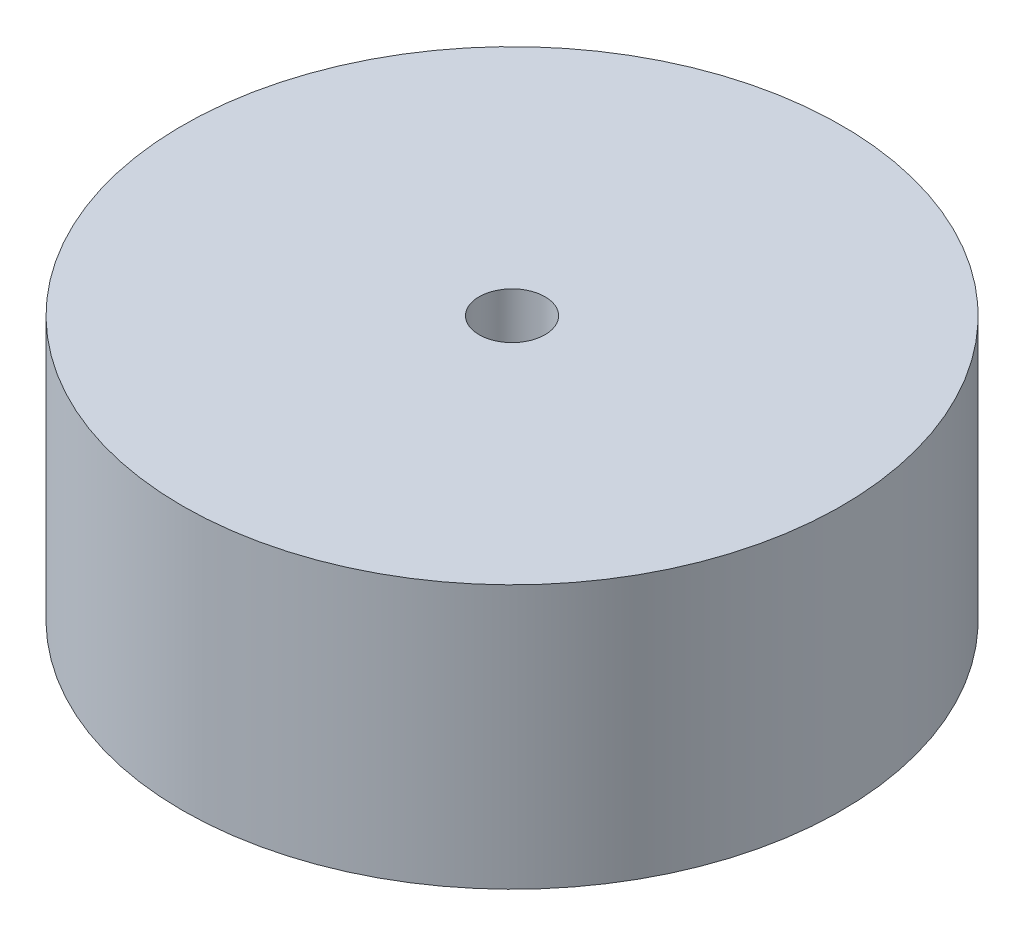
ISO-10303-21;
HEADER;
FILE_DESCRIPTION(('STEP AP214'),'2;1');
FILE_NAME('part.step','',(''),(''),'','','');
FILE_SCHEMA(('AUTOMOTIVE_DESIGN { 1 0 10303 214 1 1 1 1 }'));
ENDSEC;
DATA;
#1=APPLICATION_CONTEXT('core data for automotive mechanical design processes');
#2=APPLICATION_PROTOCOL_DEFINITION('international standard','automotive_design',2000,#1);
#3=PRODUCT_CONTEXT('',#1,'mechanical');
#4=PRODUCT('Part','Part','',(#3));
#5=PRODUCT_RELATED_PRODUCT_CATEGORY('part','',(#4));
#6=PRODUCT_DEFINITION_FORMATION('','',#4);
#7=PRODUCT_DEFINITION_CONTEXT('part definition',#1,'design');
#8=PRODUCT_DEFINITION('design','',#6,#7);
#9=PRODUCT_DEFINITION_SHAPE('','',#8);
#10=(LENGTH_UNIT() NAMED_UNIT(*) SI_UNIT(.MILLI.,.METRE.));
#11=(NAMED_UNIT(*) PLANE_ANGLE_UNIT() SI_UNIT($,.RADIAN.));
#12=(NAMED_UNIT(*) SI_UNIT($,.STERADIAN.) SOLID_ANGLE_UNIT());
#13=UNCERTAINTY_MEASURE_WITH_UNIT(LENGTH_MEASURE(1.E-05),#10,'distance_accuracy_value','');
#14=(GEOMETRIC_REPRESENTATION_CONTEXT(3) GLOBAL_UNCERTAINTY_ASSIGNED_CONTEXT((#13)) GLOBAL_UNIT_ASSIGNED_CONTEXT((#10,
#11,#12)) REPRESENTATION_CONTEXT('',''));
#15=CARTESIAN_POINT('',(0.,0.,0.));
#16=DIRECTION('',(0.,0.,1.));
#17=DIRECTION('',(1.,0.,0.));
#18=AXIS2_PLACEMENT_3D('',#15,#16,#17);
#19=CARTESIAN_POINT('',(0.,20.,0.));
#20=DIRECTION('',(0.,-1.,0.));
#21=DIRECTION('',(0.,0.,-1.));
#22=AXIS2_PLACEMENT_3D('',#19,#20,#21);
#23=CYLINDRICAL_SURFACE('',#22,2.5);
#24=CARTESIAN_POINT('',(0.,20.,0.));
#25=DIRECTION('',(0.,1.,0.));
#26=DIRECTION('',(0.,0.,1.));
#27=AXIS2_PLACEMENT_3D('',#24,#25,#26);
#28=CIRCLE('',#27,2.5);
#29=CARTESIAN_POINT('',(0.,20.,2.5));
#30=VERTEX_POINT('',#29);
#31=EDGE_CURVE('E57',#30,#30,#28,.T.);
#32=ORIENTED_EDGE('',*,*,#31,.T.);
#33=EDGE_LOOP('',(#32));
#34=FACE_BOUND('',#33,.T.);
#35=CARTESIAN_POINT('',(0.,0.,0.));
#36=DIRECTION('',(0.,-1.,0.));
#37=DIRECTION('',(0.,0.,-1.));
#38=AXIS2_PLACEMENT_3D('',#35,#36,#37);
#39=CIRCLE('',#38,2.5);
#40=CARTESIAN_POINT('',(0.,0.,-2.5));
#41=VERTEX_POINT('',#40);
#42=EDGE_CURVE('E68',#41,#41,#39,.T.);
#43=ORIENTED_EDGE('',*,*,#42,.T.);
#44=EDGE_LOOP('',(#43));
#45=FACE_BOUND('',#44,.T.);
#46=ADVANCED_FACE('F35',(#34,#45),#23,.F.);
#47=CARTESIAN_POINT('',(0.,20.,0.));
#48=DIRECTION('',(0.,1.,0.));
#49=DIRECTION('',(0.,0.,1.));
#50=AXIS2_PLACEMENT_3D('',#47,#48,#49);
#51=PLANE('',#50);
#52=CARTESIAN_POINT('',(0.,20.,0.));
#53=DIRECTION('',(0.,1.,0.));
#54=DIRECTION('',(0.,0.,1.));
#55=AXIS2_PLACEMENT_3D('',#52,#53,#54);
#56=CIRCLE('',#55,25.);
#57=CARTESIAN_POINT('',(0.,20.,25.));
#58=VERTEX_POINT('',#57);
#59=EDGE_CURVE('E56',#58,#58,#56,.T.);
#60=ORIENTED_EDGE('',*,*,#59,.T.);
#61=EDGE_LOOP('',(#60));
#62=FACE_BOUND('',#61,.T.);
#63=ORIENTED_EDGE('',*,*,#31,.F.);
#64=EDGE_LOOP('',(#63));
#65=FACE_BOUND('',#64,.T.);
#66=ADVANCED_FACE('F90',(#62,#65),#51,.T.);
#67=CARTESIAN_POINT('',(0.,0.,0.));
#68=DIRECTION('',(0.,1.,0.));
#69=DIRECTION('',(0.,0.,1.));
#70=AXIS2_PLACEMENT_3D('',#67,#68,#69);
#71=PLANE('',#70);
#72=CARTESIAN_POINT('',(0.,0.,0.));
#73=DIRECTION('',(0.,1.,0.));
#74=DIRECTION('',(0.,0.,1.));
#75=AXIS2_PLACEMENT_3D('',#72,#73,#74);
#76=CIRCLE('',#75,15.);
#77=CARTESIAN_POINT('',(0.,0.,15.));
#78=VERTEX_POINT('',#77);
#79=EDGE_CURVE('E46',#78,#78,#76,.F.);
#80=ORIENTED_EDGE('',*,*,#79,.F.);
#81=EDGE_LOOP('',(#80));
#82=FACE_BOUND('',#81,.T.);
#83=CARTESIAN_POINT('',(0.,0.,0.));
#84=DIRECTION('',(0.,1.,0.));
#85=DIRECTION('',(0.,0.,1.));
#86=AXIS2_PLACEMENT_3D('',#83,#84,#85);
#87=CIRCLE('',#86,25.);
#88=CARTESIAN_POINT('',(0.,0.,25.));
#89=VERTEX_POINT('',#88);
#90=EDGE_CURVE('E53',#89,#89,#87,.T.);
#91=ORIENTED_EDGE('',*,*,#90,.F.);
#92=EDGE_LOOP('',(#91));
#93=FACE_BOUND('',#92,.T.);
#94=ADVANCED_FACE('F86',(#82,#93),#71,.F.);
#95=CARTESIAN_POINT('',(0.,20.,0.));
#96=DIRECTION('',(0.,-1.,0.));
#97=DIRECTION('',(0.,0.,-1.));
#98=AXIS2_PLACEMENT_3D('',#95,#96,#97);
#99=CYLINDRICAL_SURFACE('',#98,25.);
#100=ORIENTED_EDGE('',*,*,#59,.F.);
#101=EDGE_LOOP('',(#100));
#102=FACE_BOUND('',#101,.T.);
#103=ORIENTED_EDGE('',*,*,#90,.T.);
#104=EDGE_LOOP('',(#103));
#105=FACE_BOUND('',#104,.T.);
#106=ADVANCED_FACE('F89',(#102,#105),#99,.T.);
#107=CARTESIAN_POINT('',(0.,-3.,0.));
#108=DIRECTION('',(0.,-1.,0.));
#109=DIRECTION('',(0.,0.,-1.));
#110=AXIS2_PLACEMENT_3D('',#107,#108,#109);
#111=PLANE('',#110);
#112=CARTESIAN_POINT('',(0.,-3.,0.));
#113=DIRECTION('',(0.,-1.,0.));
#114=DIRECTION('',(0.,0.,-1.));
#115=AXIS2_PLACEMENT_3D('',#112,#113,#114);
#116=CIRCLE('',#115,5.);
#117=CARTESIAN_POINT('',(0.,-3.,-5.));
#118=VERTEX_POINT('',#117);
#119=EDGE_CURVE('E10',#118,#118,#116,.F.);
#120=ORIENTED_EDGE('',*,*,#119,.T.);
#121=EDGE_LOOP('',(#120));
#122=FACE_BOUND('',#121,.T.);
#123=CARTESIAN_POINT('',(0.,-3.,0.));
#124=DIRECTION('',(0.,-1.,0.));
#125=DIRECTION('',(0.,0.,-1.));
#126=AXIS2_PLACEMENT_3D('',#123,#124,#125);
#127=CIRCLE('',#126,15.);
#128=CARTESIAN_POINT('',(0.,-3.,-15.));
#129=VERTEX_POINT('',#128);
#130=EDGE_CURVE('E73',#129,#129,#127,.T.);
#131=ORIENTED_EDGE('',*,*,#130,.T.);
#132=EDGE_LOOP('',(#131));
#133=FACE_BOUND('',#132,.T.);
#134=ADVANCED_FACE('F77',(#122,#133),#111,.T.);
#135=CARTESIAN_POINT('',(0.,-3.,0.));
#136=DIRECTION('',(0.,1.,0.));
#137=DIRECTION('',(0.,0.,1.));
#138=AXIS2_PLACEMENT_3D('',#135,#136,#137);
#139=CYLINDRICAL_SURFACE('',#138,15.);
#140=ORIENTED_EDGE('',*,*,#130,.F.);
#141=EDGE_LOOP('',(#140));
#142=FACE_BOUND('',#141,.T.);
#143=ORIENTED_EDGE('',*,*,#79,.T.);
#144=EDGE_LOOP('',(#143));
#145=FACE_BOUND('',#144,.T.);
#146=ADVANCED_FACE('F79',(#142,#145),#139,.T.);
#147=CARTESIAN_POINT('',(0.,0.,0.));
#148=DIRECTION('',(0.,-1.,0.));
#149=DIRECTION('',(0.,0.,-1.));
#150=AXIS2_PLACEMENT_3D('',#147,#148,#149);
#151=PLANE('',#150);
#152=ORIENTED_EDGE('',*,*,#42,.F.);
#153=EDGE_LOOP('',(#152));
#154=FACE_BOUND('',#153,.T.);
#155=ADVANCED_FACE('F82',(#154),#151,.F.);
#156=CARTESIAN_POINT('',(0.,-3.,0.));
#157=DIRECTION('',(0.,-1.,0.));
#158=DIRECTION('',(0.,0.,-1.));
#159=AXIS2_PLACEMENT_3D('',#156,#157,#158);
#160=CIRCLE('',#159,2.5);
#161=CARTESIAN_POINT('',(0.,-3.,-2.5));
#162=VERTEX_POINT('',#161);
#163=EDGE_CURVE('E50',#162,#162,#160,.T.);
#164=ORIENTED_EDGE('',*,*,#163,.F.);
#165=EDGE_LOOP('',(#164));
#166=FACE_BOUND('',#165,.T.);
#167=CARTESIAN_POINT('',(0.,-14.5,0.));
#168=DIRECTION('',(0.,-1.,0.));
#169=DIRECTION('',(0.,0.,-1.));
#170=AXIS2_PLACEMENT_3D('',#167,#168,#169);
#171=CIRCLE('',#170,2.5);
#172=CARTESIAN_POINT('',(0.,-14.5,-2.5));
#173=VERTEX_POINT('',#172);
#174=EDGE_CURVE('E65',#173,#173,#171,.F.);
#175=ORIENTED_EDGE('',*,*,#174,.F.);
#176=EDGE_LOOP('',(#175));
#177=FACE_BOUND('',#176,.T.);
#178=ADVANCED_FACE('F105',(#166,#177),#23,.F.);
#179=CARTESIAN_POINT('',(0.,-14.5,0.));
#180=DIRECTION('',(0.,-1.,0.));
#181=DIRECTION('',(0.,0.,-1.));
#182=AXIS2_PLACEMENT_3D('',#179,#180,#181);
#183=PLANE('',#182);
#184=ORIENTED_EDGE('',*,*,#174,.T.);
#185=EDGE_LOOP('',(#184));
#186=FACE_BOUND('',#185,.T.);
#187=CARTESIAN_POINT('',(0.,-14.5,0.));
#188=DIRECTION('',(0.,-1.,0.));
#189=DIRECTION('',(0.,0.,-1.));
#190=AXIS2_PLACEMENT_3D('',#187,#188,#189);
#191=CIRCLE('',#190,4.);
#192=CARTESIAN_POINT('',(0.,-14.5,4.));
#193=VERTEX_POINT('',#192);
#194=EDGE_CURVE('E62',#193,#193,#191,.T.);
#195=ORIENTED_EDGE('',*,*,#194,.T.);
#196=EDGE_LOOP('',(#195));
#197=FACE_BOUND('',#196,.T.);
#198=ADVANCED_FACE('F114',(#186,#197),#183,.T.);
#199=CARTESIAN_POINT('',(0.,-14.5,0.));
#200=DIRECTION('',(0.,1.,0.));
#201=DIRECTION('',(0.,0.,1.));
#202=AXIS2_PLACEMENT_3D('',#199,#200,#201);
#203=CYLINDRICAL_SURFACE('',#202,4.);
#204=CARTESIAN_POINT('',(0.,-4.,0.));
#205=DIRECTION('',(0.,-1.,0.));
#206=DIRECTION('',(0.,0.,-1.));
#207=AXIS2_PLACEMENT_3D('',#204,#205,#206);
#208=CIRCLE('',#207,4.);
#209=CARTESIAN_POINT('',(0.,-4.,4.));
#210=VERTEX_POINT('',#209);
#211=EDGE_CURVE('E42',#210,#210,#208,.T.);
#212=CARTESIAN_POINT('',(0.,-4.,4.));
#213=CARTESIAN_POINT('',(0.,-4.109375,4.));
#214=CARTESIAN_POINT('',(0.,-4.21875,4.));
#215=CARTESIAN_POINT('',(0.,-4.4375,4.));
#216=CARTESIAN_POINT('',(0.,-4.546875,4.));
#217=CARTESIAN_POINT('',(0.,-4.765625,4.));
#218=CARTESIAN_POINT('',(0.,-4.875,4.));
#219=CARTESIAN_POINT('',(0.,-5.09375,4.));
#220=CARTESIAN_POINT('',(0.,-5.203125,4.));
#221=CARTESIAN_POINT('',(0.,-5.421875,4.));
#222=CARTESIAN_POINT('',(0.,-5.53125,4.));
#223=CARTESIAN_POINT('',(0.,-5.75,4.));
#224=CARTESIAN_POINT('',(0.,-5.859375,4.));
#225=CARTESIAN_POINT('',(0.,-6.078125,4.));
#226=CARTESIAN_POINT('',(0.,-6.1875,4.));
#227=CARTESIAN_POINT('',(0.,-6.40625,4.));
#228=CARTESIAN_POINT('',(0.,-6.515625,4.));
#229=CARTESIAN_POINT('',(0.,-6.734375,4.));
#230=CARTESIAN_POINT('',(0.,-6.84375,4.));
#231=CARTESIAN_POINT('',(0.,-7.0625,4.));
#232=CARTESIAN_POINT('',(0.,-7.171875,4.));
#233=CARTESIAN_POINT('',(0.,-7.390625,4.));
#234=CARTESIAN_POINT('',(0.,-7.5,4.));
#235=CARTESIAN_POINT('',(0.,-7.71875,4.));
#236=CARTESIAN_POINT('',(0.,-7.828125,4.));
#237=CARTESIAN_POINT('',(0.,-8.046875,4.));
#238=CARTESIAN_POINT('',(0.,-8.15625,4.));
#239=CARTESIAN_POINT('',(0.,-8.375,4.));
#240=CARTESIAN_POINT('',(0.,-8.484375,4.));
#241=CARTESIAN_POINT('',(0.,-8.703125,4.));
#242=CARTESIAN_POINT('',(0.,-8.8125,4.));
#243=CARTESIAN_POINT('',(0.,-9.03125,4.));
#244=CARTESIAN_POINT('',(0.,-9.140625,4.));
#245=CARTESIAN_POINT('',(0.,-9.359375,4.));
#246=CARTESIAN_POINT('',(0.,-9.46875,4.));
#247=CARTESIAN_POINT('',(0.,-9.6875,4.));
#248=CARTESIAN_POINT('',(0.,-9.796875,4.));
#249=CARTESIAN_POINT('',(0.,-10.015625,4.));
#250=CARTESIAN_POINT('',(0.,-10.125,4.));
#251=CARTESIAN_POINT('',(0.,-10.34375,4.));
#252=CARTESIAN_POINT('',(0.,-10.453125,4.));
#253=CARTESIAN_POINT('',(0.,-10.671875,4.));
#254=CARTESIAN_POINT('',(0.,-10.78125,4.));
#255=CARTESIAN_POINT('',(0.,-11.,4.));
#256=CARTESIAN_POINT('',(0.,-11.109375,4.));
#257=CARTESIAN_POINT('',(0.,-11.328125,4.));
#258=CARTESIAN_POINT('',(0.,-11.4375,4.));
#259=CARTESIAN_POINT('',(0.,-11.65625,4.));
#260=CARTESIAN_POINT('',(0.,-11.765625,4.));
#261=CARTESIAN_POINT('',(0.,-11.984375,4.));
#262=CARTESIAN_POINT('',(0.,-12.09375,4.));
#263=CARTESIAN_POINT('',(0.,-12.3125,4.));
#264=CARTESIAN_POINT('',(0.,-12.421875,4.));
#265=CARTESIAN_POINT('',(0.,-12.640625,4.));
#266=CARTESIAN_POINT('',(0.,-12.75,4.));
#267=CARTESIAN_POINT('',(0.,-12.96875,4.));
#268=CARTESIAN_POINT('',(0.,-13.078125,4.));
#269=CARTESIAN_POINT('',(0.,-13.296875,4.));
#270=CARTESIAN_POINT('',(0.,-13.40625,4.));
#271=CARTESIAN_POINT('',(0.,-13.625,4.));
#272=CARTESIAN_POINT('',(0.,-13.734375,4.));
#273=CARTESIAN_POINT('',(0.,-13.953125,4.));
#274=CARTESIAN_POINT('',(0.,-14.0625,4.));
#275=CARTESIAN_POINT('',(0.,-14.28125,4.));
#276=CARTESIAN_POINT('',(0.,-14.390625,4.));
#277=CARTESIAN_POINT('',(0.,-14.5,4.));
#278=B_SPLINE_CURVE_WITH_KNOTS('',3,(#212,#213,#214,#215,#216,#217,#218,#219,#220,#221,#222,
#223,#224,#225,#226,#227,#228,#229,#230,#231,#232,#233,#234,#235,#236,#237,#238,#239,#240,#241,
#242,#243,#244,#245,#246,#247,#248,#249,#250,#251,#252,#253,#254,#255,#256,#257,#258,#259,#260,
#261,#262,#263,#264,#265,#266,#267,#268,#269,#270,#271,#272,#273,#274,#275,#276,#277),
.UNSPECIFIED.,.F.,.F.,(4,2,2,2,2,2,2,2,2,2,2,2,2,2,2,2,2,2,2,2,2,2,2,2,2,2,2,2,2,2,2,2,4),(0.,
0.328125,0.656250000000001,0.984374999999999,1.3125,1.640625,1.96875,2.296875,2.625,2.953125,
3.28125,3.609375,3.9375,4.265625,4.59375,4.921875,5.25,5.578125,5.90625,6.234375,6.5625,
6.890625,7.21875,7.546875,7.875,8.203125,8.53125,8.859375,9.1875,9.515625,9.84375,10.171875,
10.5),.UNSPECIFIED.);
#279=EDGE_CURVE('BSEAM120',#210,#193,#278,.T.);
#280=ORIENTED_EDGE('',*,*,#211,.T.);
#281=ORIENTED_EDGE('',*,*,#194,.F.);
#282=ORIENTED_EDGE('',*,*,#279,.T.);
#283=ORIENTED_EDGE('',*,*,#279,.F.);
#284=EDGE_LOOP('',(#280,#282,#281,#283));
#285=FACE_BOUND('',#284,.T.);
#286=ADVANCED_FACE('F120',(#285),#203,.T.);
#287=ORIENTED_EDGE('',*,*,#163,.T.);
#288=EDGE_LOOP('',(#287));
#289=FACE_BOUND('',#288,.T.);
#290=ADVANCED_FACE('F100',(#289),#111,.T.);
#291=CARTESIAN_POINT('',(0.,-4.,0.));
#292=DIRECTION('',(0.,-1.,0.));
#293=DIRECTION('',(0.,0.,-1.));
#294=AXIS2_PLACEMENT_3D('',#291,#292,#293);
#295=TOROIDAL_SURFACE('',#294,5.,1.);
#296=ORIENTED_EDGE('',*,*,#119,.F.);
#297=EDGE_LOOP('',(#296));
#298=FACE_BOUND('',#297,.T.);
#299=ORIENTED_EDGE('',*,*,#211,.F.);
#300=EDGE_LOOP('',(#299));
#301=FACE_BOUND('',#300,.T.);
#302=ADVANCED_FACE('F37',(#298,#301),#295,.F.);
#303=CLOSED_SHELL('',(#46,#66,#94,#106,#134,#146,#155,#178,#198,#286,#290,#302));
#304=MANIFOLD_SOLID_BREP('B2',#303);
#305=ADVANCED_BREP_SHAPE_REPRESENTATION('',(#18,#304),#14);
#306=SHAPE_DEFINITION_REPRESENTATION(#9,#305);
ENDSEC;
END-ISO-10303-21;
